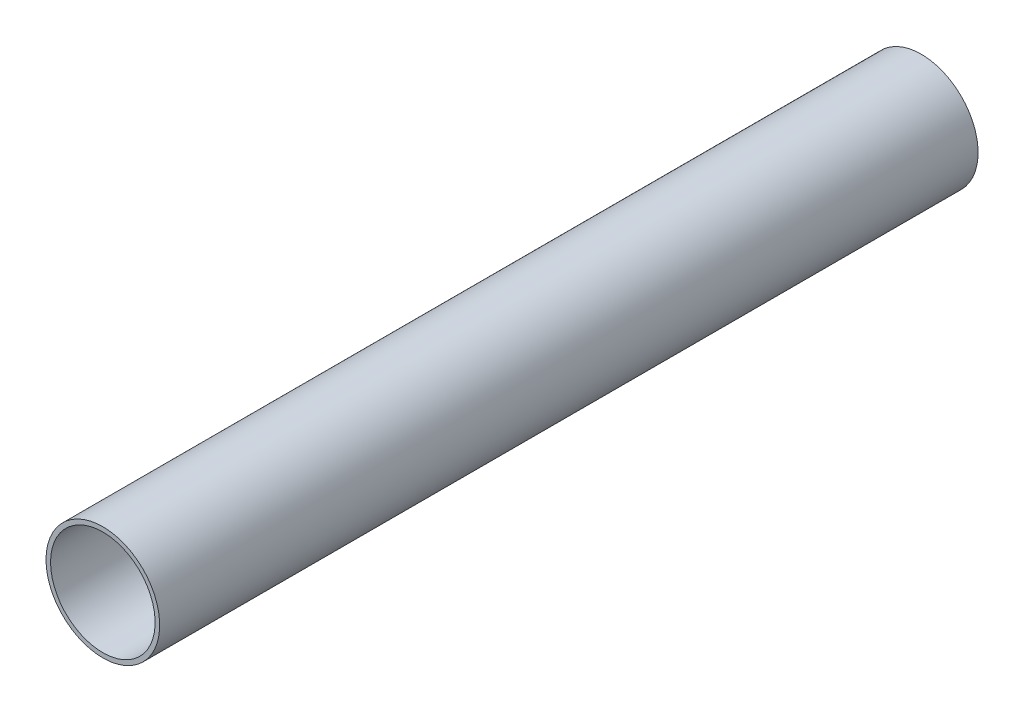
ISO-10303-21;
HEADER;
FILE_DESCRIPTION(('STEP AP214'),'2;1');
FILE_NAME('part.step','',(''),(''),'','','');
FILE_SCHEMA(('AUTOMOTIVE_DESIGN { 1 0 10303 214 1 1 1 1 }'));
ENDSEC;
DATA;
#1=APPLICATION_CONTEXT('core data for automotive mechanical design processes');
#2=APPLICATION_PROTOCOL_DEFINITION('international standard','automotive_design',2000,#1);
#3=PRODUCT_CONTEXT('',#1,'mechanical');
#4=PRODUCT('Part','Part','',(#3));
#5=PRODUCT_RELATED_PRODUCT_CATEGORY('part','',(#4));
#6=PRODUCT_DEFINITION_FORMATION('','',#4);
#7=PRODUCT_DEFINITION_CONTEXT('part definition',#1,'design');
#8=PRODUCT_DEFINITION('design','',#6,#7);
#9=PRODUCT_DEFINITION_SHAPE('','',#8);
#10=(LENGTH_UNIT() NAMED_UNIT(*) SI_UNIT(.MILLI.,.METRE.));
#11=(NAMED_UNIT(*) PLANE_ANGLE_UNIT() SI_UNIT($,.RADIAN.));
#12=(NAMED_UNIT(*) SI_UNIT($,.STERADIAN.) SOLID_ANGLE_UNIT());
#13=UNCERTAINTY_MEASURE_WITH_UNIT(LENGTH_MEASURE(1.E-05),#10,'distance_accuracy_value','');
#14=(GEOMETRIC_REPRESENTATION_CONTEXT(3) GLOBAL_UNCERTAINTY_ASSIGNED_CONTEXT((#13)) GLOBAL_UNIT_ASSIGNED_CONTEXT((#10,
#11,#12)) REPRESENTATION_CONTEXT('',''));
#15=CARTESIAN_POINT('',(0.,0.,0.));
#16=DIRECTION('',(0.,0.,1.));
#17=DIRECTION('',(1.,0.,0.));
#18=AXIS2_PLACEMENT_3D('',#15,#16,#17);
#19=CARTESIAN_POINT('',(0.,0.,180.));
#20=DIRECTION('',(0.,0.,1.));
#21=DIRECTION('',(1.,0.,0.));
#22=AXIS2_PLACEMENT_3D('',#19,#20,#21);
#23=PLANE('',#22);
#24=CARTESIAN_POINT('',(0.,0.,180.));
#25=DIRECTION('',(0.,0.,1.));
#26=DIRECTION('',(1.,0.,0.));
#27=AXIS2_PLACEMENT_3D('',#24,#25,#26);
#28=CIRCLE('',#27,12.5);
#29=CARTESIAN_POINT('',(-12.5,0.,180.));
#30=VERTEX_POINT('',#29);
#31=EDGE_CURVE('E10',#30,#30,#28,.T.);
#32=ORIENTED_EDGE('',*,*,#31,.T.);
#33=EDGE_LOOP('',(#32));
#34=FACE_BOUND('',#33,.T.);
#35=CARTESIAN_POINT('',(0.,0.,180.));
#36=DIRECTION('',(0.,0.,1.));
#37=DIRECTION('',(1.,0.,0.));
#38=AXIS2_PLACEMENT_3D('',#35,#36,#37);
#39=CIRCLE('',#38,11.5);
#40=CARTESIAN_POINT('',(-11.5,0.,180.));
#41=VERTEX_POINT('',#40);
#42=EDGE_CURVE('E44',#41,#41,#39,.T.);
#43=ORIENTED_EDGE('',*,*,#42,.F.);
#44=EDGE_LOOP('',(#43));
#45=FACE_BOUND('',#44,.T.);
#46=ADVANCED_FACE('F33',(#34,#45),#23,.T.);
#47=CARTESIAN_POINT('',(0.,0.,0.));
#48=DIRECTION('',(0.,0.,1.));
#49=DIRECTION('',(1.,0.,0.));
#50=AXIS2_PLACEMENT_3D('',#47,#48,#49);
#51=PLANE('',#50);
#52=CARTESIAN_POINT('',(0.,0.,0.));
#53=DIRECTION('',(0.,0.,1.));
#54=DIRECTION('',(1.,0.,0.));
#55=AXIS2_PLACEMENT_3D('',#52,#53,#54);
#56=CIRCLE('',#55,12.5);
#57=CARTESIAN_POINT('',(-12.5,0.,0.));
#58=VERTEX_POINT('',#57);
#59=EDGE_CURVE('E37',#58,#58,#56,.T.);
#60=ORIENTED_EDGE('',*,*,#59,.F.);
#61=EDGE_LOOP('',(#60));
#62=FACE_BOUND('',#61,.T.);
#63=CARTESIAN_POINT('',(0.,0.,0.));
#64=DIRECTION('',(0.,0.,1.));
#65=DIRECTION('',(1.,0.,0.));
#66=AXIS2_PLACEMENT_3D('',#63,#64,#65);
#67=CIRCLE('',#66,11.5);
#68=CARTESIAN_POINT('',(-11.5,0.,0.));
#69=VERTEX_POINT('',#68);
#70=EDGE_CURVE('E46',#69,#69,#67,.T.);
#71=ORIENTED_EDGE('',*,*,#70,.T.);
#72=EDGE_LOOP('',(#71));
#73=FACE_BOUND('',#72,.T.);
#74=ADVANCED_FACE('F56',(#62,#73),#51,.F.);
#75=CARTESIAN_POINT('',(0.,0.,180.));
#76=DIRECTION('',(0.,0.,-1.));
#77=DIRECTION('',(-1.,0.,0.));
#78=AXIS2_PLACEMENT_3D('',#75,#76,#77);
#79=CYLINDRICAL_SURFACE('',#78,12.5);
#80=CARTESIAN_POINT('',(-12.5,0.,180.));
#81=CARTESIAN_POINT('',(-12.5,0.,178.125));
#82=CARTESIAN_POINT('',(-12.5,0.,176.25));
#83=CARTESIAN_POINT('',(-12.5,0.,172.5));
#84=CARTESIAN_POINT('',(-12.5,0.,170.625));
#85=CARTESIAN_POINT('',(-12.5,0.,166.875));
#86=CARTESIAN_POINT('',(-12.5,0.,165.));
#87=CARTESIAN_POINT('',(-12.5,0.,161.25));
#88=CARTESIAN_POINT('',(-12.5,0.,159.375));
#89=CARTESIAN_POINT('',(-12.5,0.,155.625));
#90=CARTESIAN_POINT('',(-12.5,0.,153.75));
#91=CARTESIAN_POINT('',(-12.5,0.,150.));
#92=CARTESIAN_POINT('',(-12.5,0.,148.125));
#93=CARTESIAN_POINT('',(-12.5,0.,144.375));
#94=CARTESIAN_POINT('',(-12.5,0.,142.5));
#95=CARTESIAN_POINT('',(-12.5,0.,138.75));
#96=CARTESIAN_POINT('',(-12.5,0.,136.875));
#97=CARTESIAN_POINT('',(-12.5,0.,133.125));
#98=CARTESIAN_POINT('',(-12.5,0.,131.25));
#99=CARTESIAN_POINT('',(-12.5,0.,127.5));
#100=CARTESIAN_POINT('',(-12.5,0.,125.625));
#101=CARTESIAN_POINT('',(-12.5,0.,121.875));
#102=CARTESIAN_POINT('',(-12.5,0.,120.));
#103=CARTESIAN_POINT('',(-12.5,0.,116.25));
#104=CARTESIAN_POINT('',(-12.5,0.,114.375));
#105=CARTESIAN_POINT('',(-12.5,0.,110.625));
#106=CARTESIAN_POINT('',(-12.5,0.,108.75));
#107=CARTESIAN_POINT('',(-12.5,0.,105.));
#108=CARTESIAN_POINT('',(-12.5,0.,103.125));
#109=CARTESIAN_POINT('',(-12.5,0.,99.3749999999999));
#110=CARTESIAN_POINT('',(-12.5,0.,97.4999999999999));
#111=CARTESIAN_POINT('',(-12.5,0.,93.7499999999999));
#112=CARTESIAN_POINT('',(-12.5,0.,91.8749999999999));
#113=CARTESIAN_POINT('',(-12.5,0.,88.1249999999999));
#114=CARTESIAN_POINT('',(-12.5,0.,86.2499999999999));
#115=CARTESIAN_POINT('',(-12.5,0.,82.4999999999999));
#116=CARTESIAN_POINT('',(-12.5,0.,80.6249999999999));
#117=CARTESIAN_POINT('',(-12.5,0.,76.8749999999999));
#118=CARTESIAN_POINT('',(-12.5,0.,74.9999999999999));
#119=CARTESIAN_POINT('',(-12.5,0.,71.2499999999999));
#120=CARTESIAN_POINT('',(-12.5,0.,69.375));
#121=CARTESIAN_POINT('',(-12.5,0.,65.6249999999999));
#122=CARTESIAN_POINT('',(-12.5,0.,63.7499999999999));
#123=CARTESIAN_POINT('',(-12.5,0.,59.9999999999999));
#124=CARTESIAN_POINT('',(-12.5,0.,58.1249999999999));
#125=CARTESIAN_POINT('',(-12.5,0.,54.375));
#126=CARTESIAN_POINT('',(-12.5,0.,52.5));
#127=CARTESIAN_POINT('',(-12.5,0.,48.75));
#128=CARTESIAN_POINT('',(-12.5,0.,46.875));
#129=CARTESIAN_POINT('',(-12.5,0.,43.125));
#130=CARTESIAN_POINT('',(-12.5,0.,41.25));
#131=CARTESIAN_POINT('',(-12.5,0.,37.5));
#132=CARTESIAN_POINT('',(-12.5,0.,35.625));
#133=CARTESIAN_POINT('',(-12.5,0.,31.875));
#134=CARTESIAN_POINT('',(-12.5,0.,30.));
#135=CARTESIAN_POINT('',(-12.5,0.,26.25));
#136=CARTESIAN_POINT('',(-12.5,0.,24.375));
#137=CARTESIAN_POINT('',(-12.5,0.,20.625));
#138=CARTESIAN_POINT('',(-12.5,0.,18.75));
#139=CARTESIAN_POINT('',(-12.5,0.,15.));
#140=CARTESIAN_POINT('',(-12.5,0.,13.125));
#141=CARTESIAN_POINT('',(-12.5,0.,9.37499999999998));
#142=CARTESIAN_POINT('',(-12.5,0.,7.49999999999997));
#143=CARTESIAN_POINT('',(-12.5,0.,3.74999999999997));
#144=CARTESIAN_POINT('',(-12.5,0.,1.87499999999997));
#145=CARTESIAN_POINT('',(-12.5,0.,0.));
#146=B_SPLINE_CURVE_WITH_KNOTS('',3,(#80,#81,#82,#83,#84,#85,#86,#87,#88,#89,#90,#91,#92,#93,
#94,#95,#96,#97,#98,#99,#100,#101,#102,#103,#104,#105,#106,#107,#108,#109,#110,#111,#112,#113,
#114,#115,#116,#117,#118,#119,#120,#121,#122,#123,#124,#125,#126,#127,#128,#129,#130,#131,#132,
#133,#134,#135,#136,#137,#138,#139,#140,#141,#142,#143,#144,#145),.UNSPECIFIED.,.F.,.F.,(4,2,2,
2,2,2,2,2,2,2,2,2,2,2,2,2,2,2,2,2,2,2,2,2,2,2,2,2,2,2,2,2,4),(0.,5.62500000000002,11.25,16.875,
22.5,28.125,33.75,39.375,45.,50.625,56.25,61.875,67.5,73.125,78.75,84.375,90.,95.625,101.25,
106.875,112.5,118.125,123.75,129.375,135.,140.625,146.25,151.875,157.5,163.125,168.75,174.375,
180.),.UNSPECIFIED.);
#147=EDGE_CURVE('BSEAM35',#30,#58,#146,.T.);
#148=ORIENTED_EDGE('',*,*,#31,.F.);
#149=ORIENTED_EDGE('',*,*,#59,.T.);
#150=ORIENTED_EDGE('',*,*,#147,.T.);
#151=ORIENTED_EDGE('',*,*,#147,.F.);
#152=EDGE_LOOP('',(#148,#150,#149,#151));
#153=FACE_BOUND('',#152,.T.);
#154=ADVANCED_FACE('F35',(#153),#79,.T.);
#155=CARTESIAN_POINT('',(0.,0.,180.));
#156=DIRECTION('',(0.,0.,-1.));
#157=DIRECTION('',(-1.,0.,0.));
#158=AXIS2_PLACEMENT_3D('',#155,#156,#157);
#159=CYLINDRICAL_SURFACE('',#158,11.5);
#160=CARTESIAN_POINT('',(-11.5,0.,180.));
#161=CARTESIAN_POINT('',(-11.5,0.,178.125));
#162=CARTESIAN_POINT('',(-11.5,0.,176.25));
#163=CARTESIAN_POINT('',(-11.5,0.,172.5));
#164=CARTESIAN_POINT('',(-11.5,0.,170.625));
#165=CARTESIAN_POINT('',(-11.5,0.,166.875));
#166=CARTESIAN_POINT('',(-11.5,0.,165.));
#167=CARTESIAN_POINT('',(-11.5,0.,161.25));
#168=CARTESIAN_POINT('',(-11.5,0.,159.375));
#169=CARTESIAN_POINT('',(-11.5,0.,155.625));
#170=CARTESIAN_POINT('',(-11.5,0.,153.75));
#171=CARTESIAN_POINT('',(-11.5,0.,150.));
#172=CARTESIAN_POINT('',(-11.5,0.,148.125));
#173=CARTESIAN_POINT('',(-11.5,0.,144.375));
#174=CARTESIAN_POINT('',(-11.5,0.,142.5));
#175=CARTESIAN_POINT('',(-11.5,0.,138.75));
#176=CARTESIAN_POINT('',(-11.5,0.,136.875));
#177=CARTESIAN_POINT('',(-11.5,0.,133.125));
#178=CARTESIAN_POINT('',(-11.5,0.,131.25));
#179=CARTESIAN_POINT('',(-11.5,0.,127.5));
#180=CARTESIAN_POINT('',(-11.5,0.,125.625));
#181=CARTESIAN_POINT('',(-11.5,0.,121.875));
#182=CARTESIAN_POINT('',(-11.5,0.,120.));
#183=CARTESIAN_POINT('',(-11.5,0.,116.25));
#184=CARTESIAN_POINT('',(-11.5,0.,114.375));
#185=CARTESIAN_POINT('',(-11.5,0.,110.625));
#186=CARTESIAN_POINT('',(-11.5,0.,108.75));
#187=CARTESIAN_POINT('',(-11.5,0.,105.));
#188=CARTESIAN_POINT('',(-11.5,0.,103.125));
#189=CARTESIAN_POINT('',(-11.5,0.,99.3749999999999));
#190=CARTESIAN_POINT('',(-11.5,0.,97.5));
#191=CARTESIAN_POINT('',(-11.5,0.,93.75));
#192=CARTESIAN_POINT('',(-11.5,0.,91.875));
#193=CARTESIAN_POINT('',(-11.5,0.,88.125));
#194=CARTESIAN_POINT('',(-11.5,0.,86.25));
#195=CARTESIAN_POINT('',(-11.5,0.,82.4999999999999));
#196=CARTESIAN_POINT('',(-11.5,0.,80.625));
#197=CARTESIAN_POINT('',(-11.5,0.,76.875));
#198=CARTESIAN_POINT('',(-11.5,0.,75.));
#199=CARTESIAN_POINT('',(-11.5,0.,71.25));
#200=CARTESIAN_POINT('',(-11.5,0.,69.375));
#201=CARTESIAN_POINT('',(-11.5,0.,65.625));
#202=CARTESIAN_POINT('',(-11.5,0.,63.75));
#203=CARTESIAN_POINT('',(-11.5,0.,60.));
#204=CARTESIAN_POINT('',(-11.5,0.,58.125));
#205=CARTESIAN_POINT('',(-11.5,0.,54.375));
#206=CARTESIAN_POINT('',(-11.5,0.,52.5));
#207=CARTESIAN_POINT('',(-11.5,0.,48.75));
#208=CARTESIAN_POINT('',(-11.5,0.,46.875));
#209=CARTESIAN_POINT('',(-11.5,0.,43.125));
#210=CARTESIAN_POINT('',(-11.5,0.,41.25));
#211=CARTESIAN_POINT('',(-11.5,0.,37.5));
#212=CARTESIAN_POINT('',(-11.5,0.,35.625));
#213=CARTESIAN_POINT('',(-11.5,0.,31.875));
#214=CARTESIAN_POINT('',(-11.5,0.,30.));
#215=CARTESIAN_POINT('',(-11.5,0.,26.25));
#216=CARTESIAN_POINT('',(-11.5,0.,24.375));
#217=CARTESIAN_POINT('',(-11.5,0.,20.625));
#218=CARTESIAN_POINT('',(-11.5,0.,18.75));
#219=CARTESIAN_POINT('',(-11.5,0.,15.));
#220=CARTESIAN_POINT('',(-11.5,0.,13.125));
#221=CARTESIAN_POINT('',(-11.5,0.,9.37499999999998));
#222=CARTESIAN_POINT('',(-11.5,0.,7.49999999999997));
#223=CARTESIAN_POINT('',(-11.5,0.,3.74999999999997));
#224=CARTESIAN_POINT('',(-11.5,0.,1.87499999999997));
#225=CARTESIAN_POINT('',(-11.5,0.,0.));
#226=B_SPLINE_CURVE_WITH_KNOTS('',3,(#160,#161,#162,#163,#164,#165,#166,#167,#168,#169,#170,
#171,#172,#173,#174,#175,#176,#177,#178,#179,#180,#181,#182,#183,#184,#185,#186,#187,#188,#189,
#190,#191,#192,#193,#194,#195,#196,#197,#198,#199,#200,#201,#202,#203,#204,#205,#206,#207,#208,
#209,#210,#211,#212,#213,#214,#215,#216,#217,#218,#219,#220,#221,#222,#223,#224,#225),
.UNSPECIFIED.,.F.,.F.,(4,2,2,2,2,2,2,2,2,2,2,2,2,2,2,2,2,2,2,2,2,2,2,2,2,2,2,2,2,2,2,2,4),(0.,
5.62499999999999,11.25,16.875,22.5,28.125,33.75,39.375,45.,50.625,56.25,61.875,67.5,73.125,
78.75,84.3749999999999,90.,95.625,101.25,106.875,112.5,118.125,123.75,129.375,135.,140.625,
146.25,151.875,157.5,163.125,168.75,174.375,180.),.UNSPECIFIED.);
#227=EDGE_CURVE('BSEAM52',#41,#69,#226,.T.);
#228=ORIENTED_EDGE('',*,*,#42,.T.);
#229=ORIENTED_EDGE('',*,*,#70,.F.);
#230=ORIENTED_EDGE('',*,*,#227,.T.);
#231=ORIENTED_EDGE('',*,*,#227,.F.);
#232=EDGE_LOOP('',(#228,#230,#229,#231));
#233=FACE_BOUND('',#232,.T.);
#234=ADVANCED_FACE('F52',(#233),#159,.F.);
#235=CLOSED_SHELL('',(#46,#74,#154,#234));
#236=MANIFOLD_SOLID_BREP('B2',#235);
#237=ADVANCED_BREP_SHAPE_REPRESENTATION('',(#18,#236),#14);
#238=SHAPE_DEFINITION_REPRESENTATION(#9,#237);
ENDSEC;
END-ISO-10303-21;
